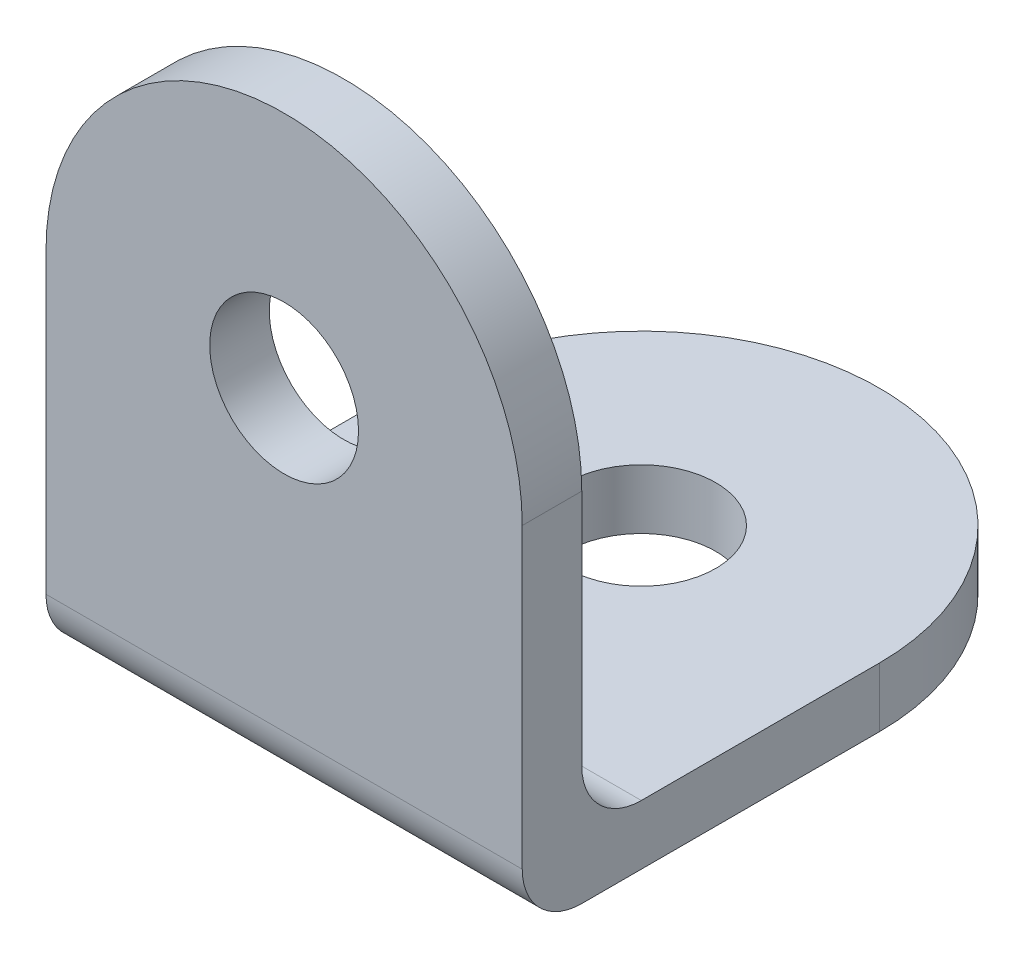
ISO-10303-21;
HEADER;
FILE_DESCRIPTION(('STEP AP214'),'2;1');
FILE_NAME('part.step','',(''),(''),'','','');
FILE_SCHEMA(('AUTOMOTIVE_DESIGN { 1 0 10303 214 1 1 1 1 }'));
ENDSEC;
DATA;
#1=APPLICATION_CONTEXT('core data for automotive mechanical design processes');
#2=APPLICATION_PROTOCOL_DEFINITION('international standard','automotive_design',2000,#1);
#3=PRODUCT_CONTEXT('',#1,'mechanical');
#4=PRODUCT('Part','Part','',(#3));
#5=PRODUCT_RELATED_PRODUCT_CATEGORY('part','',(#4));
#6=PRODUCT_DEFINITION_FORMATION('','',#4);
#7=PRODUCT_DEFINITION_CONTEXT('part definition',#1,'design');
#8=PRODUCT_DEFINITION('design','',#6,#7);
#9=PRODUCT_DEFINITION_SHAPE('','',#8);
#10=(LENGTH_UNIT() NAMED_UNIT(*) SI_UNIT(.MILLI.,.METRE.));
#11=(NAMED_UNIT(*) PLANE_ANGLE_UNIT() SI_UNIT($,.RADIAN.));
#12=(NAMED_UNIT(*) SI_UNIT($,.STERADIAN.) SOLID_ANGLE_UNIT());
#13=UNCERTAINTY_MEASURE_WITH_UNIT(LENGTH_MEASURE(1.E-05),#10,'distance_accuracy_value','');
#14=(GEOMETRIC_REPRESENTATION_CONTEXT(3) GLOBAL_UNCERTAINTY_ASSIGNED_CONTEXT((#13)) GLOBAL_UNIT_ASSIGNED_CONTEXT((#10,
#11,#12)) REPRESENTATION_CONTEXT('',''));
#15=CARTESIAN_POINT('',(0.,0.,0.));
#16=DIRECTION('',(0.,0.,1.));
#17=DIRECTION('',(1.,0.,0.));
#18=AXIS2_PLACEMENT_3D('',#15,#16,#17);
#19=CARTESIAN_POINT('',(8.,2.,-12.));
#20=DIRECTION('',(0.,1.,0.));
#21=DIRECTION('',(0.,0.,1.));
#22=AXIS2_PLACEMENT_3D('',#19,#20,#21);
#23=PLANE('',#22);
#24=CARTESIAN_POINT('',(8.,2.,-12.));
#25=DIRECTION('',(0.,1.,0.));
#26=DIRECTION('',(0.,0.,1.));
#27=AXIS2_PLACEMENT_3D('',#24,#25,#26);
#28=CIRCLE('',#27,2.5);
#29=CARTESIAN_POINT('',(8.,2.,-9.5));
#30=VERTEX_POINT('',#29);
#31=EDGE_CURVE('E127',#30,#30,#28,.T.);
#32=ORIENTED_EDGE('',*,*,#31,.F.);
#33=EDGE_LOOP('',(#32));
#34=FACE_BOUND('',#33,.T.);
#35=DIRECTION('',(0.,0.,1.));
#36=VECTOR('',#35,1.);
#37=CARTESIAN_POINT('',(0.,2.,0.));
#38=LINE('',#37,#36);
#39=CARTESIAN_POINT('',(0.,2.,-12.));
#40=VERTEX_POINT('',#39);
#41=CARTESIAN_POINT('',(0.,2.,-4.));
#42=VERTEX_POINT('',#41);
#43=EDGE_CURVE('E133',#40,#42,#38,.T.);
#44=ORIENTED_EDGE('',*,*,#43,.T.);
#45=DIRECTION('',(1.,0.,0.));
#46=VECTOR('',#45,1.);
#47=CARTESIAN_POINT('',(8.,2.,-4.));
#48=LINE('',#47,#46);
#49=CARTESIAN_POINT('',(16.,2.,-4.));
#50=VERTEX_POINT('',#49);
#51=EDGE_CURVE('E165',#42,#50,#48,.T.);
#52=ORIENTED_EDGE('',*,*,#51,.T.);
#53=DIRECTION('',(0.,0.,-1.));
#54=VECTOR('',#53,1.);
#55=CARTESIAN_POINT('',(16.,2.,0.));
#56=LINE('',#55,#54);
#57=CARTESIAN_POINT('',(16.,2.,-12.));
#58=VERTEX_POINT('',#57);
#59=EDGE_CURVE('E135',#50,#58,#56,.T.);
#60=ORIENTED_EDGE('',*,*,#59,.T.);
#61=CARTESIAN_POINT('',(8.,2.,-12.));
#62=DIRECTION('',(0.,1.,0.));
#63=DIRECTION('',(0.,0.,1.));
#64=AXIS2_PLACEMENT_3D('',#61,#62,#63);
#65=CIRCLE('',#64,8.);
#66=EDGE_CURVE('E138',#58,#40,#65,.T.);
#67=ORIENTED_EDGE('',*,*,#66,.T.);
#68=EDGE_LOOP('',(#44,#52,#60,#67));
#69=FACE_BOUND('',#68,.T.);
#70=ADVANCED_FACE('F34',(#34,#69),#23,.T.);
#71=CARTESIAN_POINT('',(8.,0.,-12.));
#72=DIRECTION('',(0.,1.,0.));
#73=DIRECTION('',(0.,0.,1.));
#74=AXIS2_PLACEMENT_3D('',#71,#72,#73);
#75=PLANE('',#74);
#76=DIRECTION('',(0.,0.,-1.));
#77=VECTOR('',#76,1.);
#78=CARTESIAN_POINT('',(16.,0.,0.));
#79=LINE('',#78,#77);
#80=CARTESIAN_POINT('',(16.,0.,-2.));
#81=VERTEX_POINT('',#80);
#82=CARTESIAN_POINT('',(16.,0.,-12.));
#83=VERTEX_POINT('',#82);
#84=EDGE_CURVE('E143',#81,#83,#79,.T.);
#85=ORIENTED_EDGE('',*,*,#84,.F.);
#86=DIRECTION('',(1.,0.,0.));
#87=VECTOR('',#86,1.);
#88=CARTESIAN_POINT('',(8.,0.,-2.));
#89=LINE('',#88,#87);
#90=CARTESIAN_POINT('',(0.,0.,-2.));
#91=VERTEX_POINT('',#90);
#92=EDGE_CURVE('E161',#81,#91,#89,.F.);
#93=ORIENTED_EDGE('',*,*,#92,.T.);
#94=DIRECTION('',(0.,0.,1.));
#95=VECTOR('',#94,1.);
#96=CARTESIAN_POINT('',(0.,0.,0.));
#97=LINE('',#96,#95);
#98=CARTESIAN_POINT('',(0.,0.,-12.));
#99=VERTEX_POINT('',#98);
#100=EDGE_CURVE('E130',#99,#91,#97,.T.);
#101=ORIENTED_EDGE('',*,*,#100,.F.);
#102=CARTESIAN_POINT('',(8.,0.,-12.));
#103=DIRECTION('',(0.,1.,0.));
#104=DIRECTION('',(0.,0.,1.));
#105=AXIS2_PLACEMENT_3D('',#102,#103,#104);
#106=CIRCLE('',#105,8.);
#107=EDGE_CURVE('E136',#83,#99,#106,.T.);
#108=ORIENTED_EDGE('',*,*,#107,.F.);
#109=EDGE_LOOP('',(#85,#93,#101,#108));
#110=FACE_BOUND('',#109,.T.);
#111=CARTESIAN_POINT('',(8.,0.,-12.));
#112=DIRECTION('',(0.,1.,0.));
#113=DIRECTION('',(0.,0.,1.));
#114=AXIS2_PLACEMENT_3D('',#111,#112,#113);
#115=CIRCLE('',#114,2.5);
#116=CARTESIAN_POINT('',(8.,0.,-9.5));
#117=VERTEX_POINT('',#116);
#118=EDGE_CURVE('E125',#117,#117,#115,.T.);
#119=ORIENTED_EDGE('',*,*,#118,.T.);
#120=EDGE_LOOP('',(#119));
#121=FACE_BOUND('',#120,.T.);
#122=ADVANCED_FACE('F183',(#110,#121),#75,.F.);
#123=CARTESIAN_POINT('',(0.,2.,0.));
#124=DIRECTION('',(1.,0.,0.));
#125=DIRECTION('',(0.,0.,-1.));
#126=AXIS2_PLACEMENT_3D('',#123,#124,#125);
#127=PLANE('',#126);
#128=ORIENTED_EDGE('',*,*,#100,.T.);
#129=CARTESIAN_POINT('',(0.,2.,-2.));
#130=DIRECTION('',(1.,0.,0.));
#131=DIRECTION('',(0.,0.,-1.));
#132=AXIS2_PLACEMENT_3D('',#129,#130,#131);
#133=CIRCLE('',#132,2.);
#134=CARTESIAN_POINT('',(0.,2.,0.));
#135=VERTEX_POINT('',#134);
#136=EDGE_CURVE('E163',#91,#135,#133,.F.);
#137=ORIENTED_EDGE('',*,*,#136,.T.);
#138=DIRECTION('',(0.,-1.,0.));
#139=VECTOR('',#138,1.);
#140=CARTESIAN_POINT('',(0.,2.,0.));
#141=LINE('',#140,#139);
#142=CARTESIAN_POINT('',(0.,12.,0.));
#143=VERTEX_POINT('',#142);
#144=EDGE_CURVE('E153',#143,#135,#141,.T.);
#145=ORIENTED_EDGE('',*,*,#144,.F.);
#146=DIRECTION('',(0.,0.,1.));
#147=VECTOR('',#146,1.);
#148=CARTESIAN_POINT('',(0.,12.,-2.));
#149=LINE('',#148,#147);
#150=CARTESIAN_POINT('',(0.,12.,-2.));
#151=VERTEX_POINT('',#150);
#152=EDGE_CURVE('E116',#151,#143,#149,.T.);
#153=ORIENTED_EDGE('',*,*,#152,.F.);
#154=DIRECTION('',(0.,-1.,0.));
#155=VECTOR('',#154,1.);
#156=CARTESIAN_POINT('',(0.,0.,-2.));
#157=LINE('',#156,#155);
#158=CARTESIAN_POINT('',(0.,4.,-2.));
#159=VERTEX_POINT('',#158);
#160=EDGE_CURVE('E108',#151,#159,#157,.T.);
#161=ORIENTED_EDGE('',*,*,#160,.T.);
#162=CARTESIAN_POINT('',(0.,4.,-4.));
#163=DIRECTION('',(1.,0.,0.));
#164=DIRECTION('',(0.,0.,-1.));
#165=AXIS2_PLACEMENT_3D('',#162,#163,#164);
#166=CIRCLE('',#165,2.);
#167=EDGE_CURVE('E11',#159,#42,#166,.T.);
#168=ORIENTED_EDGE('',*,*,#167,.T.);
#169=ORIENTED_EDGE('',*,*,#43,.F.);
#170=DIRECTION('',(0.,-1.,0.));
#171=VECTOR('',#170,1.);
#172=CARTESIAN_POINT('',(0.,2.,-12.));
#173=LINE('',#172,#171);
#174=EDGE_CURVE('E140',#40,#99,#173,.T.);
#175=ORIENTED_EDGE('',*,*,#174,.T.);
#176=EDGE_LOOP('',(#128,#137,#145,#153,#161,#168,#169,#175));
#177=FACE_BOUND('',#176,.T.);
#178=ADVANCED_FACE('F179',(#177),#127,.F.);
#179=CARTESIAN_POINT('',(0.,2.,0.));
#180=DIRECTION('',(0.,0.,-1.));
#181=DIRECTION('',(-1.,0.,0.));
#182=AXIS2_PLACEMENT_3D('',#179,#180,#181);
#183=PLANE('',#182);
#184=ORIENTED_EDGE('',*,*,#144,.T.);
#185=DIRECTION('',(1.,0.,0.));
#186=VECTOR('',#185,1.);
#187=CARTESIAN_POINT('',(0.,2.,0.));
#188=LINE('',#187,#186);
#189=CARTESIAN_POINT('',(16.,2.,0.));
#190=VERTEX_POINT('',#189);
#191=EDGE_CURVE('E156',#135,#190,#188,.T.);
#192=ORIENTED_EDGE('',*,*,#191,.T.);
#193=DIRECTION('',(0.,-1.,0.));
#194=VECTOR('',#193,1.);
#195=CARTESIAN_POINT('',(16.,2.,0.));
#196=LINE('',#195,#194);
#197=CARTESIAN_POINT('',(16.,12.,0.));
#198=VERTEX_POINT('',#197);
#199=EDGE_CURVE('E151',#198,#190,#196,.T.);
#200=ORIENTED_EDGE('',*,*,#199,.F.);
#201=CARTESIAN_POINT('',(8.,12.,0.));
#202=DIRECTION('',(0.,0.,1.));
#203=DIRECTION('',(1.,0.,0.));
#204=AXIS2_PLACEMENT_3D('',#201,#202,#203);
#205=CIRCLE('',#204,8.);
#206=EDGE_CURVE('E115',#198,#143,#205,.T.);
#207=ORIENTED_EDGE('',*,*,#206,.T.);
#208=EDGE_LOOP('',(#184,#192,#200,#207));
#209=FACE_BOUND('',#208,.T.);
#210=CARTESIAN_POINT('',(8.,12.,0.));
#211=DIRECTION('',(0.,0.,1.));
#212=DIRECTION('',(1.,0.,0.));
#213=AXIS2_PLACEMENT_3D('',#210,#211,#212);
#214=CIRCLE('',#213,2.5);
#215=CARTESIAN_POINT('',(10.5,12.,0.));
#216=VERTEX_POINT('',#215);
#217=EDGE_CURVE('E304',#216,#216,#214,.T.);
#218=ORIENTED_EDGE('',*,*,#217,.F.);
#219=EDGE_LOOP('',(#218));
#220=FACE_BOUND('',#219,.T.);
#221=ADVANCED_FACE('F182',(#209,#220),#183,.F.);
#222=CARTESIAN_POINT('',(16.,2.,0.));
#223=DIRECTION('',(-1.,0.,0.));
#224=DIRECTION('',(0.,0.,1.));
#225=AXIS2_PLACEMENT_3D('',#222,#223,#224);
#226=PLANE('',#225);
#227=ORIENTED_EDGE('',*,*,#199,.T.);
#228=CARTESIAN_POINT('',(16.,2.,-2.));
#229=DIRECTION('',(-1.,0.,0.));
#230=DIRECTION('',(0.,0.,1.));
#231=AXIS2_PLACEMENT_3D('',#228,#229,#230);
#232=CIRCLE('',#231,2.);
#233=EDGE_CURVE('E159',#190,#81,#232,.F.);
#234=ORIENTED_EDGE('',*,*,#233,.T.);
#235=ORIENTED_EDGE('',*,*,#84,.T.);
#236=DIRECTION('',(0.,-1.,0.));
#237=VECTOR('',#236,1.);
#238=CARTESIAN_POINT('',(16.,2.,-12.));
#239=LINE('',#238,#237);
#240=EDGE_CURVE('E148',#58,#83,#239,.T.);
#241=ORIENTED_EDGE('',*,*,#240,.F.);
#242=ORIENTED_EDGE('',*,*,#59,.F.);
#243=CARTESIAN_POINT('',(16.,4.,-4.));
#244=DIRECTION('',(-1.,0.,0.));
#245=DIRECTION('',(0.,0.,1.));
#246=AXIS2_PLACEMENT_3D('',#243,#244,#245);
#247=CIRCLE('',#246,2.);
#248=CARTESIAN_POINT('',(16.,4.,-2.));
#249=VERTEX_POINT('',#248);
#250=EDGE_CURVE('E42',#50,#249,#247,.T.);
#251=ORIENTED_EDGE('',*,*,#250,.T.);
#252=DIRECTION('',(0.,1.,0.));
#253=VECTOR('',#252,1.);
#254=CARTESIAN_POINT('',(16.,0.,-2.));
#255=LINE('',#254,#253);
#256=CARTESIAN_POINT('',(16.,12.,-2.));
#257=VERTEX_POINT('',#256);
#258=EDGE_CURVE('E99',#249,#257,#255,.T.);
#259=ORIENTED_EDGE('',*,*,#258,.T.);
#260=DIRECTION('',(0.,0.,1.));
#261=VECTOR('',#260,1.);
#262=CARTESIAN_POINT('',(16.,12.,-2.));
#263=LINE('',#262,#261);
#264=EDGE_CURVE('E103',#257,#198,#263,.T.);
#265=ORIENTED_EDGE('',*,*,#264,.T.);
#266=EDGE_LOOP('',(#227,#234,#235,#241,#242,#251,#259,#265));
#267=FACE_BOUND('',#266,.T.);
#268=ADVANCED_FACE('F102',(#267),#226,.F.);
#269=CARTESIAN_POINT('',(8.,2.,-12.));
#270=DIRECTION('',(0.,-1.,0.));
#271=DIRECTION('',(0.,0.,-1.));
#272=AXIS2_PLACEMENT_3D('',#269,#270,#271);
#273=CYLINDRICAL_SURFACE('',#272,8.);
#274=ORIENTED_EDGE('',*,*,#107,.T.);
#275=ORIENTED_EDGE('',*,*,#174,.F.);
#276=ORIENTED_EDGE('',*,*,#66,.F.);
#277=ORIENTED_EDGE('',*,*,#240,.T.);
#278=EDGE_LOOP('',(#274,#275,#276,#277));
#279=FACE_BOUND('',#278,.T.);
#280=ADVANCED_FACE('F177',(#279),#273,.T.);
#281=CARTESIAN_POINT('',(8.,2.,-12.));
#282=DIRECTION('',(0.,-1.,0.));
#283=DIRECTION('',(0.,0.,-1.));
#284=AXIS2_PLACEMENT_3D('',#281,#282,#283);
#285=CYLINDRICAL_SURFACE('',#284,2.5);
#286=ORIENTED_EDGE('',*,*,#31,.T.);
#287=EDGE_LOOP('',(#286));
#288=FACE_BOUND('',#287,.T.);
#289=ORIENTED_EDGE('',*,*,#118,.F.);
#290=EDGE_LOOP('',(#289));
#291=FACE_BOUND('',#290,.T.);
#292=ADVANCED_FACE('F200',(#288,#291),#285,.F.);
#293=CARTESIAN_POINT('',(8.,12.,-2.));
#294=DIRECTION('',(0.,0.,1.));
#295=DIRECTION('',(1.,0.,0.));
#296=AXIS2_PLACEMENT_3D('',#293,#294,#295);
#297=CYLINDRICAL_SURFACE('',#296,8.);
#298=ORIENTED_EDGE('',*,*,#206,.F.);
#299=ORIENTED_EDGE('',*,*,#264,.F.);
#300=CARTESIAN_POINT('',(8.,12.,-2.));
#301=DIRECTION('',(0.,0.,1.));
#302=DIRECTION('',(1.,0.,0.));
#303=AXIS2_PLACEMENT_3D('',#300,#301,#302);
#304=CIRCLE('',#303,8.);
#305=EDGE_CURVE('E107',#257,#151,#304,.T.);
#306=ORIENTED_EDGE('',*,*,#305,.T.);
#307=ORIENTED_EDGE('',*,*,#152,.T.);
#308=EDGE_LOOP('',(#298,#299,#306,#307));
#309=FACE_BOUND('',#308,.T.);
#310=ADVANCED_FACE('F112',(#309),#297,.T.);
#311=CARTESIAN_POINT('',(8.,12.,-2.));
#312=DIRECTION('',(0.,0.,1.));
#313=DIRECTION('',(1.,0.,0.));
#314=AXIS2_PLACEMENT_3D('',#311,#312,#313);
#315=PLANE('',#314);
#316=ORIENTED_EDGE('',*,*,#258,.F.);
#317=DIRECTION('',(1.,0.,0.));
#318=VECTOR('',#317,1.);
#319=CARTESIAN_POINT('',(8.,4.,-2.));
#320=LINE('',#319,#318);
#321=EDGE_CURVE('E55',#249,#159,#320,.F.);
#322=ORIENTED_EDGE('',*,*,#321,.T.);
#323=ORIENTED_EDGE('',*,*,#160,.F.);
#324=ORIENTED_EDGE('',*,*,#305,.F.);
#325=EDGE_LOOP('',(#316,#322,#323,#324));
#326=FACE_BOUND('',#325,.T.);
#327=CARTESIAN_POINT('',(8.,12.,-2.));
#328=DIRECTION('',(0.,0.,1.));
#329=DIRECTION('',(1.,0.,0.));
#330=AXIS2_PLACEMENT_3D('',#327,#328,#329);
#331=CIRCLE('',#330,2.5);
#332=CARTESIAN_POINT('',(10.5,12.,-2.));
#333=VERTEX_POINT('',#332);
#334=EDGE_CURVE('E124',#333,#333,#331,.T.);
#335=ORIENTED_EDGE('',*,*,#334,.T.);
#336=EDGE_LOOP('',(#335));
#337=FACE_BOUND('',#336,.T.);
#338=ADVANCED_FACE('F118',(#326,#337),#315,.F.);
#339=CARTESIAN_POINT('',(8.,12.,-2.));
#340=DIRECTION('',(0.,0.,1.));
#341=DIRECTION('',(1.,0.,0.));
#342=AXIS2_PLACEMENT_3D('',#339,#340,#341);
#343=CYLINDRICAL_SURFACE('',#342,2.5);
#344=ORIENTED_EDGE('',*,*,#334,.F.);
#345=EDGE_LOOP('',(#344));
#346=FACE_BOUND('',#345,.T.);
#347=ORIENTED_EDGE('',*,*,#217,.T.);
#348=EDGE_LOOP('',(#347));
#349=FACE_BOUND('',#348,.T.);
#350=ADVANCED_FACE('F232',(#346,#349),#343,.F.);
#351=CARTESIAN_POINT('',(0.,2.,-2.));
#352=DIRECTION('',(1.,0.,0.));
#353=DIRECTION('',(0.,0.,-1.));
#354=AXIS2_PLACEMENT_3D('',#351,#352,#353);
#355=CYLINDRICAL_SURFACE('',#354,2.);
#356=ORIENTED_EDGE('',*,*,#136,.F.);
#357=ORIENTED_EDGE('',*,*,#92,.F.);
#358=ORIENTED_EDGE('',*,*,#233,.F.);
#359=ORIENTED_EDGE('',*,*,#191,.F.);
#360=EDGE_LOOP('',(#356,#357,#358,#359));
#361=FACE_BOUND('',#360,.T.);
#362=ADVANCED_FACE('F239',(#361),#355,.T.);
#363=CARTESIAN_POINT('',(8.,4.,-4.));
#364=DIRECTION('',(1.,0.,0.));
#365=DIRECTION('',(0.,0.,-1.));
#366=AXIS2_PLACEMENT_3D('',#363,#364,#365);
#367=CYLINDRICAL_SURFACE('',#366,2.);
#368=ORIENTED_EDGE('',*,*,#167,.F.);
#369=ORIENTED_EDGE('',*,*,#321,.F.);
#370=ORIENTED_EDGE('',*,*,#250,.F.);
#371=ORIENTED_EDGE('',*,*,#51,.F.);
#372=EDGE_LOOP('',(#368,#369,#370,#371));
#373=FACE_BOUND('',#372,.T.);
#374=ADVANCED_FACE('F36',(#373),#367,.F.);
#375=CLOSED_SHELL('',(#70,#122,#178,#221,#268,#280,#292,#310,#338,#350,#362,#374));
#376=MANIFOLD_SOLID_BREP('B2',#375);
#377=ADVANCED_BREP_SHAPE_REPRESENTATION('',(#18,#376),#14);
#378=SHAPE_DEFINITION_REPRESENTATION(#9,#377);
ENDSEC;
END-ISO-10303-21;
